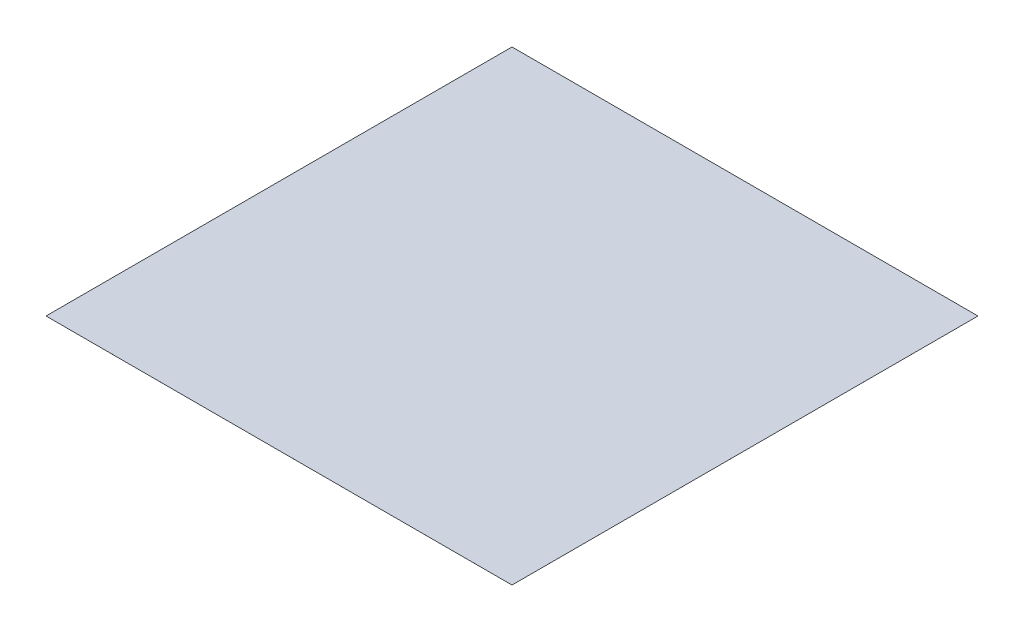
ISO-10303-21;
HEADER;
FILE_DESCRIPTION(('STEP AP214'),'2;1');
FILE_NAME('part.step','',(''),(''),'','','');
FILE_SCHEMA(('AUTOMOTIVE_DESIGN { 1 0 10303 214 1 1 1 1 }'));
ENDSEC;
DATA;
#1=APPLICATION_CONTEXT('core data for automotive mechanical design processes');
#2=APPLICATION_PROTOCOL_DEFINITION('international standard','automotive_design',2000,#1);
#3=PRODUCT_CONTEXT('',#1,'mechanical');
#4=PRODUCT('Part','Part','',(#3));
#5=PRODUCT_RELATED_PRODUCT_CATEGORY('part','',(#4));
#6=PRODUCT_DEFINITION_FORMATION('','',#4);
#7=PRODUCT_DEFINITION_CONTEXT('part definition',#1,'design');
#8=PRODUCT_DEFINITION('design','',#6,#7);
#9=PRODUCT_DEFINITION_SHAPE('','',#8);
#10=(LENGTH_UNIT() NAMED_UNIT(*) SI_UNIT(.MILLI.,.METRE.));
#11=(NAMED_UNIT(*) PLANE_ANGLE_UNIT() SI_UNIT($,.RADIAN.));
#12=(NAMED_UNIT(*) SI_UNIT($,.STERADIAN.) SOLID_ANGLE_UNIT());
#13=UNCERTAINTY_MEASURE_WITH_UNIT(LENGTH_MEASURE(1.E-05),#10,'distance_accuracy_value','');
#14=(GEOMETRIC_REPRESENTATION_CONTEXT(3) GLOBAL_UNCERTAINTY_ASSIGNED_CONTEXT((#13)) GLOBAL_UNIT_ASSIGNED_CONTEXT((#10,
#11,#12)) REPRESENTATION_CONTEXT('',''));
#15=CARTESIAN_POINT('',(0.,0.,0.));
#16=DIRECTION('',(0.,0.,1.));
#17=DIRECTION('',(1.,0.,0.));
#18=AXIS2_PLACEMENT_3D('',#15,#16,#17);
#19=CARTESIAN_POINT('',(-5000.,-0.0249999999999417,-5000.));
#20=DIRECTION('',(-1.,0.,0.));
#21=DIRECTION('',(0.,0.,1.));
#22=AXIS2_PLACEMENT_3D('',#19,#20,#21);
#23=PLANE('',#22);
#24=DIRECTION('',(0.,0.,1.));
#25=VECTOR('',#24,1.);
#26=CARTESIAN_POINT('',(-5000.,-0.0249999999999417,-5000.));
#27=LINE('',#26,#25);
#28=CARTESIAN_POINT('',(-5000.,-0.0249999999999417,-5000.));
#29=VERTEX_POINT('',#28);
#30=CARTESIAN_POINT('',(-5000.,-0.0249999999999417,5000.));
#31=VERTEX_POINT('',#30);
#32=EDGE_CURVE('E36',#29,#31,#27,.T.);
#33=ORIENTED_EDGE('',*,*,#32,.T.);
#34=DIRECTION('',(0.,-1.,0.));
#35=VECTOR('',#34,1.);
#36=CARTESIAN_POINT('',(-5000.,-0.0249999999999417,5000.));
#37=LINE('',#36,#35);
#38=CARTESIAN_POINT('',(-5000.,0.0249999999999417,5000.));
#39=VERTEX_POINT('',#38);
#40=EDGE_CURVE('E73',#39,#31,#37,.T.);
#41=ORIENTED_EDGE('',*,*,#40,.F.);
#42=DIRECTION('',(0.,0.,1.));
#43=VECTOR('',#42,1.);
#44=CARTESIAN_POINT('',(-5000.,0.0249999999999417,-5000.));
#45=LINE('',#44,#43);
#46=CARTESIAN_POINT('',(-5000.,0.0249999999999417,-5000.));
#47=VERTEX_POINT('',#46);
#48=EDGE_CURVE('E11',#47,#39,#45,.T.);
#49=ORIENTED_EDGE('',*,*,#48,.F.);
#50=DIRECTION('',(0.,-1.,0.));
#51=VECTOR('',#50,1.);
#52=CARTESIAN_POINT('',(-5000.,-0.0249999999999417,-5000.));
#53=LINE('',#52,#51);
#54=EDGE_CURVE('E74',#47,#29,#53,.T.);
#55=ORIENTED_EDGE('',*,*,#54,.T.);
#56=EDGE_LOOP('',(#33,#41,#49,#55));
#57=FACE_BOUND('',#56,.T.);
#58=ADVANCED_FACE('F33',(#57),#23,.T.);
#59=CARTESIAN_POINT('',(-5000.,0.0249999999999417,-5000.));
#60=DIRECTION('',(0.,1.,0.));
#61=DIRECTION('',(0.,0.,1.));
#62=AXIS2_PLACEMENT_3D('',#59,#60,#61);
#63=PLANE('',#62);
#64=ORIENTED_EDGE('',*,*,#48,.T.);
#65=DIRECTION('',(-1.,0.,0.));
#66=VECTOR('',#65,1.);
#67=CARTESIAN_POINT('',(-5000.,0.0249999999999417,5000.));
#68=LINE('',#67,#66);
#69=CARTESIAN_POINT('',(5000.,0.0249999999999417,5000.));
#70=VERTEX_POINT('',#69);
#71=EDGE_CURVE('E90',#70,#39,#68,.T.);
#72=ORIENTED_EDGE('',*,*,#71,.F.);
#73=DIRECTION('',(0.,0.,1.));
#74=VECTOR('',#73,1.);
#75=CARTESIAN_POINT('',(5000.,0.0249999999999417,-5000.));
#76=LINE('',#75,#74);
#77=CARTESIAN_POINT('',(5000.,0.0249999999999417,-5000.));
#78=VERTEX_POINT('',#77);
#79=EDGE_CURVE('E41',#78,#70,#76,.T.);
#80=ORIENTED_EDGE('',*,*,#79,.F.);
#81=DIRECTION('',(-1.,0.,0.));
#82=VECTOR('',#81,1.);
#83=CARTESIAN_POINT('',(-5000.,0.0249999999999417,-5000.));
#84=LINE('',#83,#82);
#85=EDGE_CURVE('E79',#78,#47,#84,.T.);
#86=ORIENTED_EDGE('',*,*,#85,.T.);
#87=EDGE_LOOP('',(#64,#72,#80,#86));
#88=FACE_BOUND('',#87,.T.);
#89=ADVANCED_FACE('F105',(#88),#63,.T.);
#90=CARTESIAN_POINT('',(5000.,-0.0249999999999417,-5000.));
#91=DIRECTION('',(1.,0.,0.));
#92=DIRECTION('',(0.,0.,-1.));
#93=AXIS2_PLACEMENT_3D('',#90,#91,#92);
#94=PLANE('',#93);
#95=ORIENTED_EDGE('',*,*,#79,.T.);
#96=DIRECTION('',(0.,1.,0.));
#97=VECTOR('',#96,1.);
#98=CARTESIAN_POINT('',(5000.,-0.0249999999999417,5000.));
#99=LINE('',#98,#97);
#100=CARTESIAN_POINT('',(5000.,-0.0249999999999417,5000.));
#101=VERTEX_POINT('',#100);
#102=EDGE_CURVE('E86',#101,#70,#99,.T.);
#103=ORIENTED_EDGE('',*,*,#102,.F.);
#104=DIRECTION('',(0.,0.,1.));
#105=VECTOR('',#104,1.);
#106=CARTESIAN_POINT('',(5000.,-0.0249999999999417,-5000.));
#107=LINE('',#106,#105);
#108=CARTESIAN_POINT('',(5000.,-0.0249999999999417,-5000.));
#109=VERTEX_POINT('',#108);
#110=EDGE_CURVE('E78',#109,#101,#107,.T.);
#111=ORIENTED_EDGE('',*,*,#110,.F.);
#112=DIRECTION('',(0.,1.,0.));
#113=VECTOR('',#112,1.);
#114=CARTESIAN_POINT('',(5000.,-0.0249999999999417,-5000.));
#115=LINE('',#114,#113);
#116=EDGE_CURVE('E98',#109,#78,#115,.T.);
#117=ORIENTED_EDGE('',*,*,#116,.T.);
#118=EDGE_LOOP('',(#95,#103,#111,#117));
#119=FACE_BOUND('',#118,.T.);
#120=ADVANCED_FACE('F102',(#119),#94,.T.);
#121=CARTESIAN_POINT('',(-5000.,-0.0249999999999417,-5000.));
#122=DIRECTION('',(0.,-1.,0.));
#123=DIRECTION('',(0.,0.,-1.));
#124=AXIS2_PLACEMENT_3D('',#121,#122,#123);
#125=PLANE('',#124);
#126=ORIENTED_EDGE('',*,*,#110,.T.);
#127=DIRECTION('',(1.,0.,0.));
#128=VECTOR('',#127,1.);
#129=CARTESIAN_POINT('',(-5000.,-0.0249999999999417,5000.));
#130=LINE('',#129,#128);
#131=EDGE_CURVE('E81',#31,#101,#130,.T.);
#132=ORIENTED_EDGE('',*,*,#131,.F.);
#133=ORIENTED_EDGE('',*,*,#32,.F.);
#134=DIRECTION('',(1.,0.,0.));
#135=VECTOR('',#134,1.);
#136=CARTESIAN_POINT('',(-5000.,-0.0249999999999417,-5000.));
#137=LINE('',#136,#135);
#138=EDGE_CURVE('E96',#29,#109,#137,.T.);
#139=ORIENTED_EDGE('',*,*,#138,.T.);
#140=EDGE_LOOP('',(#126,#132,#133,#139));
#141=FACE_BOUND('',#140,.T.);
#142=ADVANCED_FACE('F82',(#141),#125,.T.);
#143=CARTESIAN_POINT('',(0.,0.,-5000.));
#144=DIRECTION('',(0.,0.,-1.));
#145=DIRECTION('',(-1.,0.,0.));
#146=AXIS2_PLACEMENT_3D('',#143,#144,#145);
#147=PLANE('',#146);
#148=ORIENTED_EDGE('',*,*,#54,.F.);
#149=ORIENTED_EDGE('',*,*,#85,.F.);
#150=ORIENTED_EDGE('',*,*,#116,.F.);
#151=ORIENTED_EDGE('',*,*,#138,.F.);
#152=EDGE_LOOP('',(#148,#149,#150,#151));
#153=FACE_BOUND('',#152,.T.);
#154=ADVANCED_FACE('F107',(#153),#147,.T.);
#155=CARTESIAN_POINT('',(0.,0.,5000.));
#156=DIRECTION('',(0.,0.,-1.));
#157=DIRECTION('',(-1.,0.,0.));
#158=AXIS2_PLACEMENT_3D('',#155,#156,#157);
#159=PLANE('',#158);
#160=ORIENTED_EDGE('',*,*,#40,.T.);
#161=ORIENTED_EDGE('',*,*,#131,.T.);
#162=ORIENTED_EDGE('',*,*,#102,.T.);
#163=ORIENTED_EDGE('',*,*,#71,.T.);
#164=EDGE_LOOP('',(#160,#161,#162,#163));
#165=FACE_BOUND('',#164,.T.);
#166=ADVANCED_FACE('F89',(#165),#159,.F.);
#167=CLOSED_SHELL('',(#58,#89,#120,#142,#154,#166));
#168=MANIFOLD_SOLID_BREP('B2',#167);
#169=ADVANCED_BREP_SHAPE_REPRESENTATION('',(#18,#168),#14);
#170=SHAPE_DEFINITION_REPRESENTATION(#9,#169);
ENDSEC;
END-ISO-10303-21;
